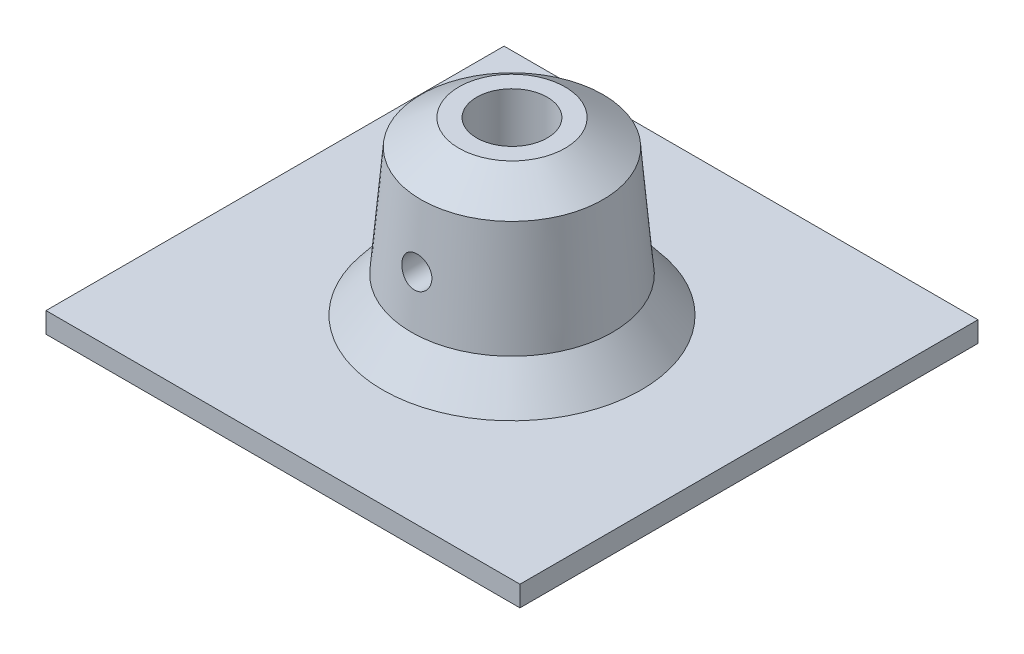
ISO-10303-21;
HEADER;
FILE_DESCRIPTION(('STEP AP214'),'2;1');
FILE_NAME('part.step','',(''),(''),'','','');
FILE_SCHEMA(('AUTOMOTIVE_DESIGN { 1 0 10303 214 1 1 1 1 }'));
ENDSEC;
DATA;
#1=APPLICATION_CONTEXT('core data for automotive mechanical design processes');
#2=APPLICATION_PROTOCOL_DEFINITION('international standard','automotive_design',2000,#1);
#3=PRODUCT_CONTEXT('',#1,'mechanical');
#4=PRODUCT('Part','Part','',(#3));
#5=PRODUCT_RELATED_PRODUCT_CATEGORY('part','',(#4));
#6=PRODUCT_DEFINITION_FORMATION('','',#4);
#7=PRODUCT_DEFINITION_CONTEXT('part definition',#1,'design');
#8=PRODUCT_DEFINITION('design','',#6,#7);
#9=PRODUCT_DEFINITION_SHAPE('','',#8);
#10=(LENGTH_UNIT() NAMED_UNIT(*) SI_UNIT(.MILLI.,.METRE.));
#11=(NAMED_UNIT(*) PLANE_ANGLE_UNIT() SI_UNIT($,.RADIAN.));
#12=(NAMED_UNIT(*) SI_UNIT($,.STERADIAN.) SOLID_ANGLE_UNIT());
#13=UNCERTAINTY_MEASURE_WITH_UNIT(LENGTH_MEASURE(1.E-05),#10,'distance_accuracy_value','');
#14=(GEOMETRIC_REPRESENTATION_CONTEXT(3) GLOBAL_UNCERTAINTY_ASSIGNED_CONTEXT((#13)) GLOBAL_UNIT_ASSIGNED_CONTEXT((#10,
#11,#12)) REPRESENTATION_CONTEXT('',''));
#15=CARTESIAN_POINT('',(0.,0.,0.));
#16=DIRECTION('',(0.,0.,1.));
#17=DIRECTION('',(1.,0.,0.));
#18=AXIS2_PLACEMENT_3D('',#15,#16,#17);
#19=CARTESIAN_POINT('',(0.,1.2,0.));
#20=DIRECTION('',(0.,-1.,0.));
#21=DIRECTION('',(0.,0.,1.));
#22=AXIS2_PLACEMENT_3D('',#19,#20,#21);
#23=CONICAL_SURFACE('',#22,6.065,0.0872664625997165);
#24=CARTESIAN_POINT('',(0.,9.70570795286237,0.));
#25=DIRECTION('',(0.,-1.,0.));
#26=DIRECTION('',(0.,0.,-1.));
#27=AXIS2_PLACEMENT_3D('',#24,#25,#26);
#28=CIRCLE('',#27,5.32084697886225);
#29=CARTESIAN_POINT('',(0.,9.70570795286237,-5.32084697886225));
#30=VERTEX_POINT('',#29);
#31=EDGE_CURVE('E55',#30,#30,#28,.T.);
#32=ORIENTED_EDGE('',*,*,#31,.T.);
#33=EDGE_LOOP('',(#32));
#34=FACE_BOUND('',#33,.T.);
#35=CARTESIAN_POINT('',(0.,3.27671274521286,0.));
#36=DIRECTION('',(0.,1.,0.));
#37=DIRECTION('',(0.,0.,1.));
#38=AXIS2_PLACEMENT_3D('',#35,#36,#37);
#39=CIRCLE('',#38,5.88331117739407);
#40=CARTESIAN_POINT('',(0.,3.27671274521286,5.88331117739407));
#41=VERTEX_POINT('',#40);
#42=EDGE_CURVE('E139',#41,#41,#39,.T.);
#43=ORIENTED_EDGE('',*,*,#42,.T.);
#44=EDGE_LOOP('',(#43));
#45=FACE_BOUND('',#44,.T.);
#46=CARTESIAN_POINT('',(-0.499910206662621,5.48186360856146,5.66838102173419));
#47=CARTESIAN_POINT('',(-0.460340405354894,5.45431964429686,5.67428908043872));
#48=CARTESIAN_POINT('',(-0.41841865630602,5.43000637843616,5.67969950877163));
#49=CARTESIAN_POINT('',(-0.3309833722427,5.38857128706683,5.68909782330586));
#50=CARTESIAN_POINT('',(-0.28546746116944,5.37145426699828,5.6930847586737));
#51=CARTESIAN_POINT('',(-0.192084222165942,5.34496490931166,5.69931812581675));
#52=CARTESIAN_POINT('',(-0.144215520053636,5.3355971561062,5.7015635272636));
#53=CARTESIAN_POINT('',(-0.0475446835610527,5.32494085106396,5.70412115427526));
#54=CARTESIAN_POINT('',(0.00125724574030764,5.32365054419647,5.70443379978026));
#55=CARTESIAN_POINT('',(0.0976934768385633,5.32914906617271,5.70311066239115));
#56=CARTESIAN_POINT('',(0.14533458294563,5.3358259857278,5.70150186814569));
#57=CARTESIAN_POINT('',(0.238793940569608,5.35685293215283,5.69651174697133));
#58=CARTESIAN_POINT('',(0.284612117455591,5.3712032728269,5.69313034755196));
#59=CARTESIAN_POINT('',(0.373334278040421,5.40719055643384,5.68484774857018));
#60=CARTESIAN_POINT('',(0.416227070365906,5.42885378079274,5.67994107249417));
#61=CARTESIAN_POINT('',(0.497796447034452,5.47881213803531,5.66898714470039));
#62=CARTESIAN_POINT('',(0.536472507615064,5.50710809340212,5.66293975154767));
#63=CARTESIAN_POINT('',(0.609483127817153,5.5702857950512,5.64999442425965));
#64=CARTESIAN_POINT('',(0.643694498175979,5.60530651463411,5.64307986001053));
#65=CARTESIAN_POINT('',(0.705797540511139,5.68052507904069,5.62901762042363));
#66=CARTESIAN_POINT('',(0.733688470146254,5.72072353112481,5.62186991781623));
#67=CARTESIAN_POINT('',(0.782845752606156,5.80599261484825,5.60770596952389));
#68=CARTESIAN_POINT('',(0.803985064627015,5.85113736409788,5.60069434296658));
#69=CARTESIAN_POINT('',(0.838327328024913,5.94445382973848,5.58740198702622));
#70=CARTESIAN_POINT('',(0.851530503359846,5.99262546066844,5.58112123702185));
#71=CARTESIAN_POINT('',(0.869522765079725,6.09039549821842,5.56968935237795));
#72=CARTESIAN_POINT('',(0.874353734691866,6.13998553373334,5.56453270827974));
#73=CARTESIAN_POINT('',(0.875524668686748,6.23938503226341,5.55554521789459));
#74=CARTESIAN_POINT('',(0.871865554216545,6.28919447088878,5.55171422783025));
#75=CARTESIAN_POINT('',(0.856247215639415,6.38671666931019,5.54551107041125));
#76=CARTESIAN_POINT('',(0.844429688067102,6.43445065541963,5.54311528322685));
#77=CARTESIAN_POINT('',(0.812955602582536,6.52730907823637,5.53960742095241));
#78=CARTESIAN_POINT('',(0.793299328758789,6.57243360944657,5.53849529934599));
#79=CARTESIAN_POINT('',(0.746869484696325,6.65845756377296,5.53735197383174));
#80=CARTESIAN_POINT('',(0.720147234790484,6.69938461184596,5.53731318075602));
#81=CARTESIAN_POINT('',(0.660275462965344,6.776223669793,5.53800052520688));
#82=CARTESIAN_POINT('',(0.627125728482371,6.81213551374137,5.53872668803487));
#83=CARTESIAN_POINT('',(0.555124792675521,6.87812948975549,5.54060401004773));
#84=CARTESIAN_POINT('',(0.516242757453072,6.90817791323211,5.54175752215882));
#85=CARTESIAN_POINT('',(0.434005819424236,6.96135522424666,5.54413670162931));
#86=CARTESIAN_POINT('',(0.390650811270922,6.98448394876262,5.54536237068787));
#87=CARTESIAN_POINT('',(0.300460355321302,7.02326771441157,5.54758304489876));
#88=CARTESIAN_POINT('',(0.253609016508481,7.0388858868808,5.54857690006615));
#89=CARTESIAN_POINT('',(0.157941890248874,7.06203323263923,5.55009756794292));
#90=CARTESIAN_POINT('',(0.109126130461055,7.06956251977829,5.55062438722575));
#91=CARTESIAN_POINT('',(0.0109956282210354,7.07630997521348,5.55109508060654));
#92=CARTESIAN_POINT('',(-0.0383182389085697,7.07554081128856,5.55103984323057));
#93=CARTESIAN_POINT('',(-0.136114476979583,7.06574412450683,5.55036051179019));
#94=CARTESIAN_POINT('',(-0.184596847800813,7.05671660045645,5.54973641764357));
#95=CARTESIAN_POINT('',(-0.279306762847533,7.03067589752145,5.54805754825717));
#96=CARTESIAN_POINT('',(-0.325536495677045,7.0136706475319,5.54700320077231));
#97=CARTESIAN_POINT('',(-0.414491837054394,6.97215975536726,5.54470840421041));
#98=CARTESIAN_POINT('',(-0.457217361168599,6.94765393253373,5.5434679506512));
#99=CARTESIAN_POINT('',(-0.538058525960608,6.89176467285379,5.54111980663856));
#100=CARTESIAN_POINT('',(-0.576163115509949,6.86036523432114,5.54001243450884));
#101=CARTESIAN_POINT('',(-0.646565538342822,6.79160706531249,5.53829464573011));
#102=CARTESIAN_POINT('',(-0.678863433788569,6.75424839863972,5.53768422376086));
#103=CARTESIAN_POINT('',(-0.736684378595305,6.67469494137546,5.5373107933443));
#104=CARTESIAN_POINT('',(-0.762217812963619,6.63250770803733,5.53754647773784));
#105=CARTESIAN_POINT('',(-0.80584161228032,6.54446696268146,5.53915074753926));
#106=CARTESIAN_POINT('',(-0.823932427374329,6.49861367259513,5.5405192644159));
#107=CARTESIAN_POINT('',(-0.852065252734028,6.40490583173296,5.54455733058333));
#108=CARTESIAN_POINT('',(-0.862162448320918,6.35706744515397,5.54721775128644));
#109=CARTESIAN_POINT('',(-0.874263856439551,6.26047263883788,5.55387866241072));
#110=CARTESIAN_POINT('',(-0.8762683669902,6.21171625297318,5.55787910347881));
#111=CARTESIAN_POINT('',(-0.872182673253398,6.11467016249768,5.56711577844972));
#112=CARTESIAN_POINT('',(-0.86609319716891,6.06638041629774,5.57235190114539));
#113=CARTESIAN_POINT('',(-0.846047080694631,5.97157584435604,5.58381953013034));
#114=CARTESIAN_POINT('',(-0.832088357833356,5.92506149192445,5.5900512995888));
#115=CARTESIAN_POINT('',(-0.796472458502758,5.83439953059079,5.60324927979943));
#116=CARTESIAN_POINT('',(-0.774706392821751,5.7902961192334,5.61022484463163));
#117=CARTESIAN_POINT('',(-0.724138104501923,5.70639597298309,5.62437585598406));
#118=CARTESIAN_POINT('',(-0.695341215857516,5.66659600611811,5.63155114734088));
#119=CARTESIAN_POINT('',(-0.6394448765468,5.601594264057,5.6438542476952));
#120=CARTESIAN_POINT('',(-0.613704080186244,5.57522347833106,5.64904750131418));
#121=CARTESIAN_POINT('',(-0.559070970079364,5.52589289275871,5.65905123439782));
#122=CARTESIAN_POINT('',(-0.530178687788427,5.50293305887256,5.66386171768214));
#123=CARTESIAN_POINT('',(-0.499910206662621,5.48186360856146,5.66838102173419));
#124=B_SPLINE_CURVE_WITH_KNOTS('',3,(#46,#47,#48,#49,#50,#51,#52,#53,#54,#55,#56,#57,#58,#59,
#60,#61,#62,#63,#64,#65,#66,#67,#68,#69,#70,#71,#72,#73,#74,#75,#76,#77,#78,#79,#80,#81,#82,#83,
#84,#85,#86,#87,#88,#89,#90,#91,#92,#93,#94,#95,#96,#97,#98,#99,#100,#101,#102,#103,#104,#105,
#106,#107,#108,#109,#110,#111,#112,#113,#114,#115,#116,#117,#118,#119,#120,#121,#122,#123),
.UNSPECIFIED.,.T.,.F.,(4,2,2,2,2,2,2,2,2,2,2,2,2,2,2,2,2,2,2,2,2,2,2,2,2,2,2,2,2,2,2,2,2,2,2,2,
2,2,4),(0.,0.14558950708766,0.291276080711518,0.437048779990958,0.582789805343695,
0.726507592508911,0.870231257454688,1.01447704257437,1.15874072417516,1.30639003723825,
1.45405668286303,1.60435734544418,1.75465376633927,1.90419611251173,2.05372223457506,
2.20071462719536,2.34770169306397,2.49364919207189,2.63960151854057,2.78636967922983,
2.93314129737475,3.08062623075615,3.22810908828179,3.3753668416824,3.52262461636621,
3.66973634368668,3.81685161461189,3.96431205444115,4.11177091557289,4.25900206396997,
4.40622430620091,4.55242108880759,4.69861248756424,4.84479073460603,4.99100768357596,
5.13934871688992,5.28757755780415,5.39894574977747,5.5103128302722),.UNSPECIFIED.);
#125=CARTESIAN_POINT('',(-0.499910206662621,5.48186360856146,5.66838102173419));
#126=VERTEX_POINT('',#125);
#127=EDGE_CURVE('E165',#126,#126,#124,.T.);
#128=ORIENTED_EDGE('',*,*,#127,.F.);
#129=EDGE_LOOP('',(#128));
#130=FACE_BOUND('',#129,.T.);
#131=ADVANCED_FACE('F39',(#34,#45,#130),#23,.T.);
#132=CARTESIAN_POINT('',(0.,2.2,0.));
#133=DIRECTION('',(0.,1.,0.));
#134=DIRECTION('',(0.,0.,1.));
#135=AXIS2_PLACEMENT_3D('',#132,#133,#134);
#136=CYLINDRICAL_SURFACE('',#135,2.065);
#137=CARTESIAN_POINT('',(0.,2.2,0.));
#138=DIRECTION('',(0.,1.,0.));
#139=DIRECTION('',(0.,0.,1.));
#140=AXIS2_PLACEMENT_3D('',#137,#138,#139);
#141=CIRCLE('',#140,2.065);
#142=CARTESIAN_POINT('',(0.,2.2,2.065));
#143=VERTEX_POINT('',#142);
#144=EDGE_CURVE('E122',#143,#143,#141,.T.);
#145=ORIENTED_EDGE('',*,*,#144,.F.);
#146=EDGE_LOOP('',(#145));
#147=FACE_BOUND('',#146,.T.);
#148=CARTESIAN_POINT('',(0.,11.2,0.));
#149=DIRECTION('',(0.,1.,0.));
#150=DIRECTION('',(0.,0.,1.));
#151=AXIS2_PLACEMENT_3D('',#148,#149,#150);
#152=CIRCLE('',#151,2.065);
#153=CARTESIAN_POINT('',(0.,11.2,2.065));
#154=VERTEX_POINT('',#153);
#155=EDGE_CURVE('E162',#154,#154,#152,.T.);
#156=ORIENTED_EDGE('',*,*,#155,.T.);
#157=EDGE_LOOP('',(#156));
#158=FACE_BOUND('',#157,.T.);
#159=CARTESIAN_POINT('',(0.,5.325,2.065));
#160=CARTESIAN_POINT('',(-0.0468025669590415,5.32500526270906,2.06499601813905));
#161=CARTESIAN_POINT('',(-0.0936751791000415,5.3287772685366,2.06339053392436));
#162=CARTESIAN_POINT('',(-0.186088821772375,5.34372970674641,2.05712304626192));
#163=CARTESIAN_POINT('',(-0.231626131121253,5.35492910418817,2.05245321865999));
#164=CARTESIAN_POINT('',(-0.319879643469858,5.38424537425213,2.04055806980868));
#165=CARTESIAN_POINT('',(-0.362604950966292,5.40233848894928,2.0333415315613));
#166=CARTESIAN_POINT('',(-0.444371313291325,5.44482883884417,2.01705219096515));
#167=CARTESIAN_POINT('',(-0.483413410019774,5.46922428390631,2.00797991587837));
#168=CARTESIAN_POINT('',(-0.558781392008688,5.52495402010702,1.98836006596028));
#169=CARTESIAN_POINT('',(-0.594892569491212,5.55656112995277,1.97776311473753));
#170=CARTESIAN_POINT('',(-0.661487393907858,5.62523962965933,1.95649785654547));
#171=CARTESIAN_POINT('',(-0.691967983248709,5.66231396886939,1.9458295140475));
#172=CARTESIAN_POINT('',(-0.747983121657179,5.7431777426166,1.92501576794938));
#173=CARTESIAN_POINT('',(-0.773183821071575,5.78721405814742,1.91492524731627));
#174=CARTESIAN_POINT('',(-0.81572440675737,5.87938929129154,1.89719629321596));
#175=CARTESIAN_POINT('',(-0.833068478761529,5.927526008077,1.88955655469353));
#176=CARTESIAN_POINT('',(-0.858509147108959,6.02406391898062,1.87813045487582));
#177=CARTESIAN_POINT('',(-0.86701973789537,6.07233491330114,1.87417258818976));
#178=CARTESIAN_POINT('',(-0.875842561870282,6.16976952750573,1.87006712116165));
#179=CARTESIAN_POINT('',(-0.876159541436811,6.21893261410125,1.86991731489512));
#180=CARTESIAN_POINT('',(-0.868897176182127,6.31256565969889,1.87330025630307));
#181=CARTESIAN_POINT('',(-0.861945903320815,6.35709707232424,1.87654010702048));
#182=CARTESIAN_POINT('',(-0.841400586087231,6.44428894804975,1.88584088671487));
#183=CARTESIAN_POINT('',(-0.827805217638766,6.48694903637345,1.89190237799429));
#184=CARTESIAN_POINT('',(-0.794090745452663,6.57028338612536,1.90630161100839));
#185=CARTESIAN_POINT('',(-0.773836997183686,6.61089480188353,1.91468571712044));
#186=CARTESIAN_POINT('',(-0.727476244644283,6.68830403669742,1.93277559510169));
#187=CARTESIAN_POINT('',(-0.701366888857713,6.72510031495116,1.94248189732669));
#188=CARTESIAN_POINT('',(-0.641349849651442,6.79723081993947,1.96315742749677));
#189=CARTESIAN_POINT('',(-0.606959115490581,6.83215393185103,1.97416276658957));
#190=CARTESIAN_POINT('',(-0.532703894942347,6.89587777818099,1.99548057032653));
#191=CARTESIAN_POINT('',(-0.492838042079658,6.92467697961227,2.00579286104036));
#192=CARTESIAN_POINT('',(-0.407478462613487,6.9759667392302,2.02488092618909));
#193=CARTESIAN_POINT('',(-0.36187037561316,6.99828459253524,2.03361263947906));
#194=CARTESIAN_POINT('',(-0.26708240324614,7.03478564664145,2.04821518750965));
#195=CARTESIAN_POINT('',(-0.217904579354762,7.04897350095852,2.05408765855698));
#196=CARTESIAN_POINT('',(-0.12080404775334,7.0679386712702,2.06200114020047));
#197=CARTESIAN_POINT('',(-0.0730072918791851,7.07326737213513,2.06426624000165));
#198=CARTESIAN_POINT('',(0.0228474989164967,7.07601362192868,2.0654291478759));
#199=CARTESIAN_POINT('',(0.0709054512206054,7.07343354186857,2.06432796514319));
#200=CARTESIAN_POINT('',(0.163300030931674,7.06082529057884,2.05902666755363));
#201=CARTESIAN_POINT('',(0.207700592402653,7.05118911168478,2.05498972321785));
#202=CARTESIAN_POINT('',(0.294203235761733,7.0252930825253,2.04439956639542));
#203=CARTESIAN_POINT('',(0.336305029035992,7.00903240270236,2.03784603877386));
#204=CARTESIAN_POINT('',(0.418498879621967,6.96981941354836,2.02259393610614));
#205=CARTESIAN_POINT('',(0.458487345105018,6.94667427112638,2.01383485081323));
#206=CARTESIAN_POINT('',(0.534156617157657,6.89456060417214,1.99509991621574));
#207=CARTESIAN_POINT('',(0.569835589823637,6.86558961432954,1.98512355250345));
#208=CARTESIAN_POINT('',(0.638642352279138,6.80014827752815,1.96411531981412));
#209=CARTESIAN_POINT('',(0.671387646995263,6.76328231032343,1.95305988458298));
#210=CARTESIAN_POINT('',(0.730339096261074,6.68441141279707,1.93179045229702));
#211=CARTESIAN_POINT('',(0.756543572384661,6.64240516755171,1.92157667166696));
#212=CARTESIAN_POINT('',(0.802008138913394,6.55346992597638,1.90305622706092));
#213=CARTESIAN_POINT('',(0.821147340007043,6.50647151568493,1.89478357351656));
#214=CARTESIAN_POINT('',(0.851072108588357,6.40945689411021,1.88153501829719));
#215=CARTESIAN_POINT('',(0.861864883063251,6.35944332668227,1.87655627293055));
#216=CARTESIAN_POINT('',(0.874062778293487,6.26207703771308,1.87090360626693));
#217=CARTESIAN_POINT('',(0.876142455840698,6.21482644185472,1.86992054347879));
#218=CARTESIAN_POINT('',(0.872668535313714,6.12067458468138,1.87154442590677));
#219=CARTESIAN_POINT('',(0.86711620917076,6.07377326646626,1.87415077292068));
#220=CARTESIAN_POINT('',(0.84910887641455,5.98406207758105,1.88237316151702));
#221=CARTESIAN_POINT('',(0.837011229077446,5.94116475721889,1.88783292846692));
#222=CARTESIAN_POINT('',(0.806612770015879,5.85800236224652,1.90101916013039));
#223=CARTESIAN_POINT('',(0.788310203046075,5.81773803630559,1.90874626614473));
#224=CARTESIAN_POINT('',(0.744732557832383,5.73829088231199,1.92618288860592));
#225=CARTESIAN_POINT('',(0.719099111560992,5.69932530556625,1.93598483129232));
#226=CARTESIAN_POINT('',(0.662079943582693,5.62603781682187,1.95621819746375));
#227=CARTESIAN_POINT('',(0.63069211958128,5.59171760994644,1.96664985006864));
#228=CARTESIAN_POINT('',(0.560211079920259,5.52599459222108,1.98792428614795));
#229=CARTESIAN_POINT('',(0.520712380660017,5.49501499933148,1.9987375904138));
#230=CARTESIAN_POINT('',(0.43668073807699,5.44009646741095,2.01876143440518));
#231=CARTESIAN_POINT('',(0.392145522581507,5.41616072382207,2.027971245935));
#232=CARTESIAN_POINT('',(0.299931930631873,5.37650316624673,2.04362909095764));
#233=CARTESIAN_POINT('',(0.252312603174686,5.36066039800976,2.0501175168206));
#234=CARTESIAN_POINT('',(0.154835586433261,5.33736121480155,2.05976453204081));
#235=CARTESIAN_POINT('',(0.104985370257116,5.32987870407595,2.06293348088612));
#236=CARTESIAN_POINT('',(0.0366241785811507,5.32557285542765,2.06475780501257));
#237=CARTESIAN_POINT('',(0.0183174539127523,5.32499794029608,2.06500155840928));
#238=CARTESIAN_POINT('',(0.,5.325,2.065));
#239=B_SPLINE_CURVE_WITH_KNOTS('',3,(#159,#160,#161,#162,#163,#164,#165,#166,#167,#168,#169,
#170,#171,#172,#173,#174,#175,#176,#177,#178,#179,#180,#181,#182,#183,#184,#185,#186,#187,#188,
#189,#190,#191,#192,#193,#194,#195,#196,#197,#198,#199,#200,#201,#202,#203,#204,#205,#206,#207,
#208,#209,#210,#211,#212,#213,#214,#215,#216,#217,#218,#219,#220,#221,#222,#223,#224,#225,#226,
#227,#228,#229,#230,#231,#232,#233,#234,#235,#236,#237,#238),.UNSPECIFIED.,.T.,.F.,(4,2,2,2,2,2,
2,2,2,2,2,2,2,2,2,2,2,2,2,2,2,2,2,2,2,2,2,2,2,2,2,2,2,2,2,2,2,2,2,4),(0.,0.140354254326488,
0.281068275364149,0.421301674778007,0.561495285526354,0.708295585197059,0.855175369377323,
1.00958830938804,1.16391888662026,1.3106358781354,1.45726787783169,1.59219932027784,
1.72715766366305,1.86503281018502,2.00296342456887,2.15298849866481,2.30305108416195,
2.45680684340981,2.61047450653068,2.75416101011942,2.8978044414573,3.03402095344406,
3.17025452847972,3.31073578461583,3.45127661345241,3.60218745674654,3.75313698524464,
3.9065611851919,4.05985275775763,4.20102851215798,4.34218074140166,4.47630669837945,
4.61047062856026,4.75285110501157,4.89528370253745,5.04859820687052,5.20198215548524,
5.35300119421695,5.50354751276717,5.55847895674831),.UNSPECIFIED.);
#240=CARTESIAN_POINT('',(0.,5.325,2.065));
#241=VERTEX_POINT('',#240);
#242=EDGE_CURVE('E43',#241,#241,#239,.T.);
#243=ORIENTED_EDGE('',*,*,#242,.F.);
#244=EDGE_LOOP('',(#243));
#245=FACE_BOUND('',#244,.T.);
#246=ADVANCED_FACE('F188',(#147,#158,#245),#136,.F.);
#247=CARTESIAN_POINT('',(13.85,1.2,-13.385));
#248=DIRECTION('',(-1.,0.,0.));
#249=DIRECTION('',(0.,0.,1.));
#250=AXIS2_PLACEMENT_3D('',#247,#248,#249);
#251=PLANE('',#250);
#252=DIRECTION('',(0.,0.,-1.));
#253=VECTOR('',#252,1.);
#254=CARTESIAN_POINT('',(13.85,0.,-13.385));
#255=LINE('',#254,#253);
#256=CARTESIAN_POINT('',(13.85,0.,13.385));
#257=VERTEX_POINT('',#256);
#258=CARTESIAN_POINT('',(13.85,0.,-13.385));
#259=VERTEX_POINT('',#258);
#260=EDGE_CURVE('E118',#257,#259,#255,.T.);
#261=ORIENTED_EDGE('',*,*,#260,.T.);
#262=DIRECTION('',(0.,-1.,0.));
#263=VECTOR('',#262,1.);
#264=CARTESIAN_POINT('',(13.85,1.2,-13.385));
#265=LINE('',#264,#263);
#266=CARTESIAN_POINT('',(13.85,1.2,-13.385));
#267=VERTEX_POINT('',#266);
#268=EDGE_CURVE('E107',#267,#259,#265,.T.);
#269=ORIENTED_EDGE('',*,*,#268,.F.);
#270=DIRECTION('',(0.,0.,-1.));
#271=VECTOR('',#270,1.);
#272=CARTESIAN_POINT('',(13.85,1.2,-13.385));
#273=LINE('',#272,#271);
#274=CARTESIAN_POINT('',(13.85,1.2,13.385));
#275=VERTEX_POINT('',#274);
#276=EDGE_CURVE('E99',#275,#267,#273,.T.);
#277=ORIENTED_EDGE('',*,*,#276,.F.);
#278=DIRECTION('',(0.,-1.,0.));
#279=VECTOR('',#278,1.);
#280=CARTESIAN_POINT('',(13.85,1.2,13.385));
#281=LINE('',#280,#279);
#282=EDGE_CURVE('E114',#275,#257,#281,.T.);
#283=ORIENTED_EDGE('',*,*,#282,.T.);
#284=EDGE_LOOP('',(#261,#269,#277,#283));
#285=FACE_BOUND('',#284,.T.);
#286=ADVANCED_FACE('F191',(#285),#251,.F.);
#287=CARTESIAN_POINT('',(-13.85,1.2,-13.385));
#288=DIRECTION('',(0.,0.,1.));
#289=DIRECTION('',(1.,0.,0.));
#290=AXIS2_PLACEMENT_3D('',#287,#288,#289);
#291=PLANE('',#290);
#292=DIRECTION('',(-1.,0.,0.));
#293=VECTOR('',#292,1.);
#294=CARTESIAN_POINT('',(-13.85,0.,-13.385));
#295=LINE('',#294,#293);
#296=CARTESIAN_POINT('',(-13.85,0.,-13.385));
#297=VERTEX_POINT('',#296);
#298=EDGE_CURVE('E105',#259,#297,#295,.T.);
#299=ORIENTED_EDGE('',*,*,#298,.T.);
#300=DIRECTION('',(0.,-1.,0.));
#301=VECTOR('',#300,1.);
#302=CARTESIAN_POINT('',(-13.85,1.2,-13.385));
#303=LINE('',#302,#301);
#304=CARTESIAN_POINT('',(-13.85,1.2,-13.385));
#305=VERTEX_POINT('',#304);
#306=EDGE_CURVE('E103',#305,#297,#303,.T.);
#307=ORIENTED_EDGE('',*,*,#306,.F.);
#308=DIRECTION('',(-1.,0.,0.));
#309=VECTOR('',#308,1.);
#310=CARTESIAN_POINT('',(-13.85,1.2,-13.385));
#311=LINE('',#310,#309);
#312=EDGE_CURVE('E94',#267,#305,#311,.T.);
#313=ORIENTED_EDGE('',*,*,#312,.F.);
#314=ORIENTED_EDGE('',*,*,#268,.T.);
#315=EDGE_LOOP('',(#299,#307,#313,#314));
#316=FACE_BOUND('',#315,.T.);
#317=ADVANCED_FACE('F104',(#316),#291,.F.);
#318=CARTESIAN_POINT('',(-13.85,1.2,-13.385));
#319=DIRECTION('',(1.,0.,0.));
#320=DIRECTION('',(0.,0.,-1.));
#321=AXIS2_PLACEMENT_3D('',#318,#319,#320);
#322=PLANE('',#321);
#323=DIRECTION('',(0.,0.,1.));
#324=VECTOR('',#323,1.);
#325=CARTESIAN_POINT('',(-13.85,0.,-13.385));
#326=LINE('',#325,#324);
#327=CARTESIAN_POINT('',(-13.85,0.,13.385));
#328=VERTEX_POINT('',#327);
#329=EDGE_CURVE('E80',#297,#328,#326,.T.);
#330=ORIENTED_EDGE('',*,*,#329,.T.);
#331=DIRECTION('',(0.,-1.,0.));
#332=VECTOR('',#331,1.);
#333=CARTESIAN_POINT('',(-13.85,1.2,13.385));
#334=LINE('',#333,#332);
#335=CARTESIAN_POINT('',(-13.85,1.2,13.385));
#336=VERTEX_POINT('',#335);
#337=EDGE_CURVE('E108',#336,#328,#334,.T.);
#338=ORIENTED_EDGE('',*,*,#337,.F.);
#339=DIRECTION('',(0.,0.,1.));
#340=VECTOR('',#339,1.);
#341=CARTESIAN_POINT('',(-13.85,1.2,-13.385));
#342=LINE('',#341,#340);
#343=EDGE_CURVE('E97',#305,#336,#342,.T.);
#344=ORIENTED_EDGE('',*,*,#343,.F.);
#345=ORIENTED_EDGE('',*,*,#306,.T.);
#346=EDGE_LOOP('',(#330,#338,#344,#345));
#347=FACE_BOUND('',#346,.T.);
#348=ADVANCED_FACE('F110',(#347),#322,.F.);
#349=CARTESIAN_POINT('',(-13.85,1.2,13.385));
#350=DIRECTION('',(0.,0.,-1.));
#351=DIRECTION('',(-1.,0.,0.));
#352=AXIS2_PLACEMENT_3D('',#349,#350,#351);
#353=PLANE('',#352);
#354=DIRECTION('',(1.,0.,0.));
#355=VECTOR('',#354,1.);
#356=CARTESIAN_POINT('',(-13.85,0.,13.385));
#357=LINE('',#356,#355);
#358=EDGE_CURVE('E86',#328,#257,#357,.T.);
#359=ORIENTED_EDGE('',*,*,#358,.T.);
#360=ORIENTED_EDGE('',*,*,#282,.F.);
#361=DIRECTION('',(1.,0.,0.));
#362=VECTOR('',#361,1.);
#363=CARTESIAN_POINT('',(-13.85,1.2,13.385));
#364=LINE('',#363,#362);
#365=EDGE_CURVE('E63',#336,#275,#364,.T.);
#366=ORIENTED_EDGE('',*,*,#365,.F.);
#367=ORIENTED_EDGE('',*,*,#337,.T.);
#368=EDGE_LOOP('',(#359,#360,#366,#367));
#369=FACE_BOUND('',#368,.T.);
#370=ADVANCED_FACE('F253',(#369),#353,.F.);
#371=CARTESIAN_POINT('',(0.,1.2,0.));
#372=DIRECTION('',(0.,1.,0.));
#373=DIRECTION('',(0.,0.,1.));
#374=AXIS2_PLACEMENT_3D('',#371,#372,#373);
#375=PLANE('',#374);
#376=CARTESIAN_POINT('',(0.,1.2,0.));
#377=DIRECTION('',(0.,1.,0.));
#378=DIRECTION('',(0.,0.,1.));
#379=AXIS2_PLACEMENT_3D('',#376,#377,#378);
#380=CIRCLE('',#379,7.565);
#381=CARTESIAN_POINT('',(0.,1.2,7.565));
#382=VERTEX_POINT('',#381);
#383=EDGE_CURVE('E11',#382,#382,#380,.F.);
#384=ORIENTED_EDGE('',*,*,#383,.T.);
#385=EDGE_LOOP('',(#384));
#386=FACE_BOUND('',#385,.T.);
#387=ORIENTED_EDGE('',*,*,#276,.T.);
#388=ORIENTED_EDGE('',*,*,#312,.T.);
#389=ORIENTED_EDGE('',*,*,#343,.T.);
#390=ORIENTED_EDGE('',*,*,#365,.T.);
#391=EDGE_LOOP('',(#387,#388,#389,#390));
#392=FACE_BOUND('',#391,.T.);
#393=ADVANCED_FACE('F95',(#386,#392),#375,.T.);
#394=CARTESIAN_POINT('',(0.,0.,0.));
#395=DIRECTION('',(0.,1.,0.));
#396=DIRECTION('',(0.,0.,1.));
#397=AXIS2_PLACEMENT_3D('',#394,#395,#396);
#398=PLANE('',#397);
#399=ORIENTED_EDGE('',*,*,#260,.F.);
#400=ORIENTED_EDGE('',*,*,#358,.F.);
#401=ORIENTED_EDGE('',*,*,#329,.F.);
#402=ORIENTED_EDGE('',*,*,#298,.F.);
#403=EDGE_LOOP('',(#399,#400,#401,#402));
#404=FACE_BOUND('',#403,.T.);
#405=ADVANCED_FACE('F158',(#404),#398,.F.);
#406=CARTESIAN_POINT('',(0.,11.2,0.));
#407=DIRECTION('',(0.,1.,0.));
#408=DIRECTION('',(0.,0.,1.));
#409=AXIS2_PLACEMENT_3D('',#406,#407,#408);
#410=PLANE('',#409);
#411=CARTESIAN_POINT('',(0.,11.2,0.));
#412=DIRECTION('',(0.,1.,0.));
#413=DIRECTION('',(0.,0.,1.));
#414=AXIS2_PLACEMENT_3D('',#411,#412,#413);
#415=CIRCLE('',#414,3.10546791421701);
#416=CARTESIAN_POINT('',(0.,11.2,3.10546791421701));
#417=VERTEX_POINT('',#416);
#418=EDGE_CURVE('E135',#417,#417,#415,.T.);
#419=ORIENTED_EDGE('',*,*,#418,.T.);
#420=EDGE_LOOP('',(#419));
#421=FACE_BOUND('',#420,.T.);
#422=ORIENTED_EDGE('',*,*,#155,.F.);
#423=EDGE_LOOP('',(#422));
#424=FACE_BOUND('',#423,.T.);
#425=ADVANCED_FACE('F155',(#421,#424),#410,.T.);
#426=CARTESIAN_POINT('',(0.,2.2,0.));
#427=DIRECTION('',(0.,1.,0.));
#428=DIRECTION('',(0.,0.,1.));
#429=AXIS2_PLACEMENT_3D('',#426,#427,#428);
#430=PLANE('',#429);
#431=ORIENTED_EDGE('',*,*,#144,.T.);
#432=EDGE_LOOP('',(#431));
#433=FACE_BOUND('',#432,.T.);
#434=ADVANCED_FACE('F152',(#433),#430,.T.);
#435=CARTESIAN_POINT('',(0.,11.2,0.));
#436=DIRECTION('',(0.,-1.,0.));
#437=DIRECTION('',(0.,0.,-1.));
#438=AXIS2_PLACEMENT_3D('',#435,#436,#437);
#439=CONICAL_SURFACE('',#438,3.10546791421701,0.977384381116824);
#440=ORIENTED_EDGE('',*,*,#31,.F.);
#441=EDGE_LOOP('',(#440));
#442=FACE_BOUND('',#441,.T.);
#443=ORIENTED_EDGE('',*,*,#418,.F.);
#444=EDGE_LOOP('',(#443));
#445=FACE_BOUND('',#444,.T.);
#446=ADVANCED_FACE('F149',(#442,#445),#439,.T.);
#447=CARTESIAN_POINT('',(0.,3.27671274521286,0.));
#448=DIRECTION('',(0.,-1.,0.));
#449=DIRECTION('',(0.,0.,-1.));
#450=AXIS2_PLACEMENT_3D('',#447,#448,#449);
#451=CONICAL_SURFACE('',#450,5.88331117739407,0.680678408277783);
#452=ORIENTED_EDGE('',*,*,#383,.F.);
#453=EDGE_LOOP('',(#452));
#454=FACE_BOUND('',#453,.T.);
#455=ORIENTED_EDGE('',*,*,#42,.F.);
#456=EDGE_LOOP('',(#455));
#457=FACE_BOUND('',#456,.T.);
#458=ADVANCED_FACE('F41',(#454,#457),#451,.T.);
#459=CARTESIAN_POINT('',(0.,6.2,9.));
#460=DIRECTION('',(0.,0.,-1.));
#461=DIRECTION('',(-1.,0.,0.));
#462=AXIS2_PLACEMENT_3D('',#459,#460,#461);
#463=CYLINDRICAL_SURFACE('',#462,0.875);
#464=ORIENTED_EDGE('',*,*,#242,.T.);
#465=EDGE_LOOP('',(#464));
#466=FACE_BOUND('',#465,.T.);
#467=ORIENTED_EDGE('',*,*,#127,.T.);
#468=EDGE_LOOP('',(#467));
#469=FACE_BOUND('',#468,.T.);
#470=ADVANCED_FACE('F180',(#466,#469),#463,.F.);
#471=CLOSED_SHELL('',(#131,#246,#286,#317,#348,#370,#393,#405,#425,#434,#446,#458,#470));
#472=MANIFOLD_SOLID_BREP('B2',#471);
#473=ADVANCED_BREP_SHAPE_REPRESENTATION('',(#18,#472),#14);
#474=SHAPE_DEFINITION_REPRESENTATION(#9,#473);
ENDSEC;
END-ISO-10303-21;
